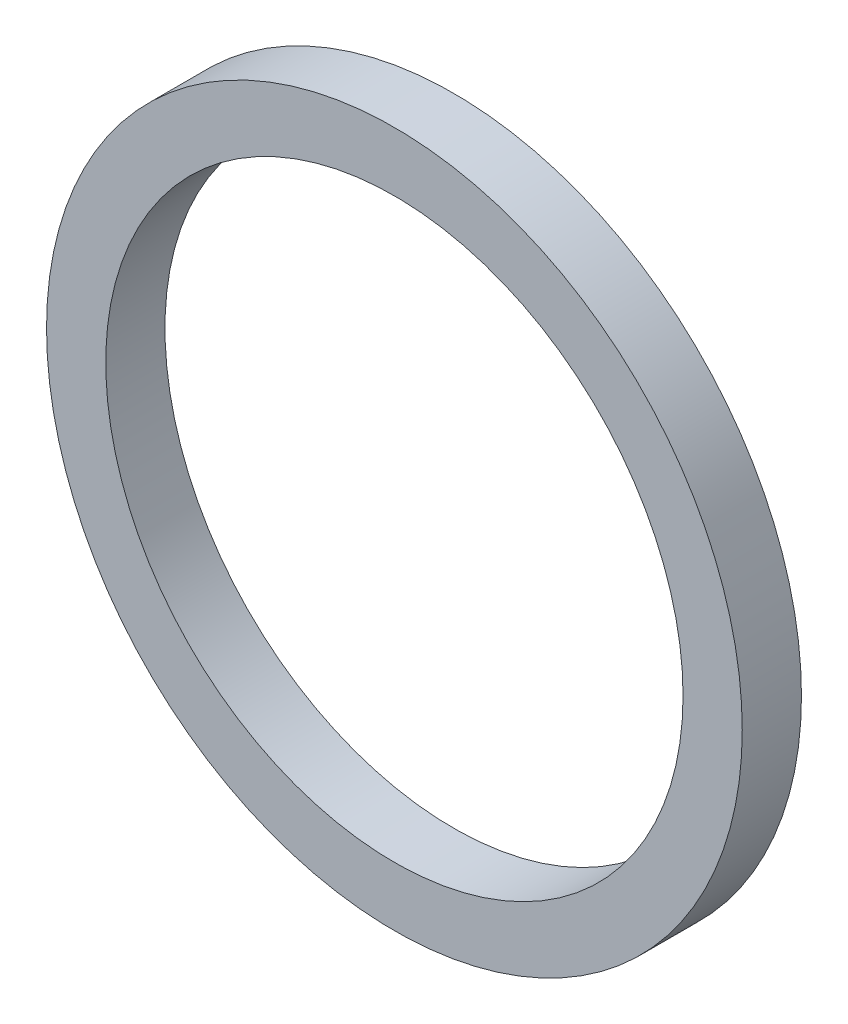
ISO-10303-21;
HEADER;
FILE_DESCRIPTION(('STEP AP214'),'2;1');
FILE_NAME('part.step','',(''),(''),'','','');
FILE_SCHEMA(('AUTOMOTIVE_DESIGN { 1 0 10303 214 1 1 1 1 }'));
ENDSEC;
DATA;
#1=APPLICATION_CONTEXT('core data for automotive mechanical design processes');
#2=APPLICATION_PROTOCOL_DEFINITION('international standard','automotive_design',2000,#1);
#3=PRODUCT_CONTEXT('',#1,'mechanical');
#4=PRODUCT('Part','Part','',(#3));
#5=PRODUCT_RELATED_PRODUCT_CATEGORY('part','',(#4));
#6=PRODUCT_DEFINITION_FORMATION('','',#4);
#7=PRODUCT_DEFINITION_CONTEXT('part definition',#1,'design');
#8=PRODUCT_DEFINITION('design','',#6,#7);
#9=PRODUCT_DEFINITION_SHAPE('','',#8);
#10=(LENGTH_UNIT() NAMED_UNIT(*) SI_UNIT(.MILLI.,.METRE.));
#11=(NAMED_UNIT(*) PLANE_ANGLE_UNIT() SI_UNIT($,.RADIAN.));
#12=(NAMED_UNIT(*) SI_UNIT($,.STERADIAN.) SOLID_ANGLE_UNIT());
#13=UNCERTAINTY_MEASURE_WITH_UNIT(LENGTH_MEASURE(1.E-05),#10,'distance_accuracy_value','');
#14=(GEOMETRIC_REPRESENTATION_CONTEXT(3) GLOBAL_UNCERTAINTY_ASSIGNED_CONTEXT((#13)) GLOBAL_UNIT_ASSIGNED_CONTEXT((#10,
#11,#12)) REPRESENTATION_CONTEXT('',''));
#15=CARTESIAN_POINT('',(0.,0.,0.));
#16=DIRECTION('',(0.,0.,1.));
#17=DIRECTION('',(1.,0.,0.));
#18=AXIS2_PLACEMENT_3D('',#15,#16,#17);
#19=CARTESIAN_POINT('',(0.,0.,29210.5902270029));
#20=DIRECTION('',(0.,0.,1.));
#21=DIRECTION('',(1.,0.,0.));
#22=AXIS2_PLACEMENT_3D('',#19,#20,#21);
#23=PLANE('',#22);
#24=CARTESIAN_POINT('',(0.,0.,29210.5902270029));
#25=DIRECTION('',(0.,0.,1.));
#26=DIRECTION('',(1.,0.,0.));
#27=AXIS2_PLACEMENT_3D('',#24,#25,#26);
#28=CIRCLE('',#27,4700.);
#29=CARTESIAN_POINT('',(4700.,0.,29210.5902270029));
#30=VERTEX_POINT('',#29);
#31=EDGE_CURVE('E10',#30,#30,#28,.T.);
#32=ORIENTED_EDGE('',*,*,#31,.T.);
#33=EDGE_LOOP('',(#32));
#34=FACE_BOUND('',#33,.T.);
#35=CARTESIAN_POINT('',(0.,0.,29210.5902270029));
#36=DIRECTION('',(0.,0.,1.));
#37=DIRECTION('',(1.,0.,0.));
#38=AXIS2_PLACEMENT_3D('',#35,#36,#37);
#39=CIRCLE('',#38,3900.);
#40=CARTESIAN_POINT('',(3900.,0.,29210.5902270029));
#41=VERTEX_POINT('',#40);
#42=EDGE_CURVE('E43',#41,#41,#39,.T.);
#43=ORIENTED_EDGE('',*,*,#42,.F.);
#44=EDGE_LOOP('',(#43));
#45=FACE_BOUND('',#44,.T.);
#46=ADVANCED_FACE('F32',(#34,#45),#23,.T.);
#47=CARTESIAN_POINT('',(0.,0.,28410.5902270029));
#48=DIRECTION('',(0.,0.,1.));
#49=DIRECTION('',(1.,0.,0.));
#50=AXIS2_PLACEMENT_3D('',#47,#48,#49);
#51=PLANE('',#50);
#52=CARTESIAN_POINT('',(0.,0.,28410.5902270029));
#53=DIRECTION('',(0.,0.,1.));
#54=DIRECTION('',(1.,0.,0.));
#55=AXIS2_PLACEMENT_3D('',#52,#53,#54);
#56=CIRCLE('',#55,4700.);
#57=CARTESIAN_POINT('',(4700.,0.,28410.5902270029));
#58=VERTEX_POINT('',#57);
#59=EDGE_CURVE('E36',#58,#58,#56,.T.);
#60=ORIENTED_EDGE('',*,*,#59,.F.);
#61=EDGE_LOOP('',(#60));
#62=FACE_BOUND('',#61,.T.);
#63=CARTESIAN_POINT('',(0.,0.,28410.5902270029));
#64=DIRECTION('',(0.,0.,1.));
#65=DIRECTION('',(1.,0.,0.));
#66=AXIS2_PLACEMENT_3D('',#63,#64,#65);
#67=CIRCLE('',#66,3900.);
#68=CARTESIAN_POINT('',(3900.,0.,28410.5902270029));
#69=VERTEX_POINT('',#68);
#70=EDGE_CURVE('E45',#69,#69,#67,.T.);
#71=ORIENTED_EDGE('',*,*,#70,.T.);
#72=EDGE_LOOP('',(#71));
#73=FACE_BOUND('',#72,.T.);
#74=ADVANCED_FACE('F55',(#62,#73),#51,.F.);
#75=CARTESIAN_POINT('',(0.,0.,29210.5902270029));
#76=DIRECTION('',(0.,0.,-1.));
#77=DIRECTION('',(-1.,0.,0.));
#78=AXIS2_PLACEMENT_3D('',#75,#76,#77);
#79=CYLINDRICAL_SURFACE('',#78,4700.);
#80=ORIENTED_EDGE('',*,*,#31,.F.);
#81=EDGE_LOOP('',(#80));
#82=FACE_BOUND('',#81,.T.);
#83=ORIENTED_EDGE('',*,*,#59,.T.);
#84=EDGE_LOOP('',(#83));
#85=FACE_BOUND('',#84,.T.);
#86=ADVANCED_FACE('F34',(#82,#85),#79,.T.);
#87=CARTESIAN_POINT('',(0.,0.,29210.5902270029));
#88=DIRECTION('',(0.,0.,-1.));
#89=DIRECTION('',(-1.,0.,0.));
#90=AXIS2_PLACEMENT_3D('',#87,#88,#89);
#91=CYLINDRICAL_SURFACE('',#90,3900.);
#92=ORIENTED_EDGE('',*,*,#42,.T.);
#93=EDGE_LOOP('',(#92));
#94=FACE_BOUND('',#93,.T.);
#95=ORIENTED_EDGE('',*,*,#70,.F.);
#96=EDGE_LOOP('',(#95));
#97=FACE_BOUND('',#96,.T.);
#98=ADVANCED_FACE('F51',(#94,#97),#91,.F.);
#99=CLOSED_SHELL('',(#46,#74,#86,#98));
#100=MANIFOLD_SOLID_BREP('B2',#99);
#101=ADVANCED_BREP_SHAPE_REPRESENTATION('',(#18,#100),#14);
#102=SHAPE_DEFINITION_REPRESENTATION(#9,#101);
ENDSEC;
END-ISO-10303-21;
